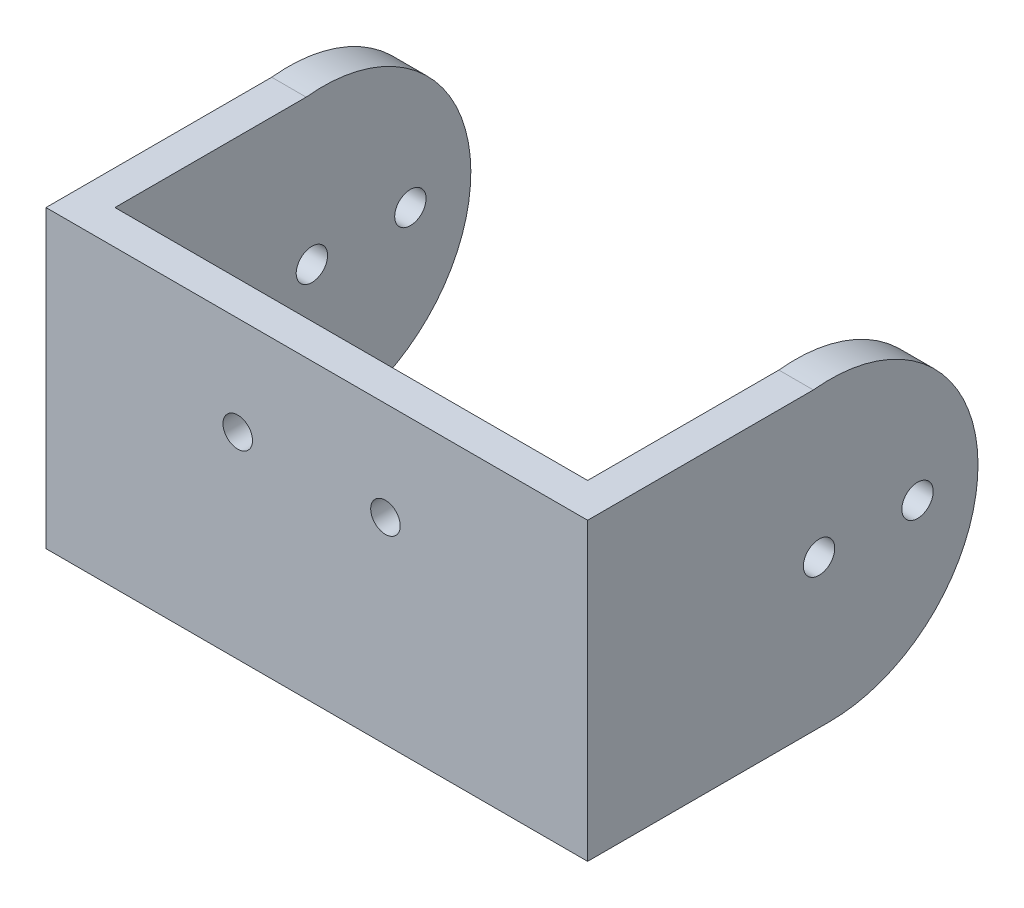
ISO-10303-21;
HEADER;
FILE_DESCRIPTION(('STEP AP214'),'2;1');
FILE_NAME('part.step','',(''),(''),'','','');
FILE_SCHEMA(('AUTOMOTIVE_DESIGN { 1 0 10303 214 1 1 1 1 }'));
ENDSEC;
DATA;
#1=APPLICATION_CONTEXT('core data for automotive mechanical design processes');
#2=APPLICATION_PROTOCOL_DEFINITION('international standard','automotive_design',2000,#1);
#3=PRODUCT_CONTEXT('',#1,'mechanical');
#4=PRODUCT('Part','Part','',(#3));
#5=PRODUCT_RELATED_PRODUCT_CATEGORY('part','',(#4));
#6=PRODUCT_DEFINITION_FORMATION('','',#4);
#7=PRODUCT_DEFINITION_CONTEXT('part definition',#1,'design');
#8=PRODUCT_DEFINITION('design','',#6,#7);
#9=PRODUCT_DEFINITION_SHAPE('','',#8);
#10=(LENGTH_UNIT() NAMED_UNIT(*) SI_UNIT(.MILLI.,.METRE.));
#11=(NAMED_UNIT(*) PLANE_ANGLE_UNIT() SI_UNIT($,.RADIAN.));
#12=(NAMED_UNIT(*) SI_UNIT($,.STERADIAN.) SOLID_ANGLE_UNIT());
#13=UNCERTAINTY_MEASURE_WITH_UNIT(LENGTH_MEASURE(1.E-05),#10,'distance_accuracy_value','');
#14=(GEOMETRIC_REPRESENTATION_CONTEXT(3) GLOBAL_UNCERTAINTY_ASSIGNED_CONTEXT((#13)) GLOBAL_UNIT_ASSIGNED_CONTEXT((#10,
#11,#12)) REPRESENTATION_CONTEXT('',''));
#15=CARTESIAN_POINT('',(0.,0.,0.));
#16=DIRECTION('',(0.,0.,1.));
#17=DIRECTION('',(1.,0.,0.));
#18=AXIS2_PLACEMENT_3D('',#15,#16,#17);
#19=CARTESIAN_POINT('',(-27.5,-15.,3.5));
#20=DIRECTION('',(1.,0.,0.));
#21=DIRECTION('',(0.,1.,0.));
#22=AXIS2_PLACEMENT_3D('',#19,#20,#21);
#23=PLANE('',#22);
#24=DIRECTION('',(0.,0.,-1.));
#25=VECTOR('',#24,1.);
#26=CARTESIAN_POINT('',(-27.5,15.,3.5));
#27=LINE('',#26,#25);
#28=CARTESIAN_POINT('',(-27.5,15.,3.5));
#29=VERTEX_POINT('',#28);
#30=CARTESIAN_POINT('',(-27.5,15.,-19.4197675165418));
#31=VERTEX_POINT('',#30);
#32=EDGE_CURVE('E172',#29,#31,#27,.T.);
#33=ORIENTED_EDGE('',*,*,#32,.T.);
#34=CARTESIAN_POINT('',(-27.5,0.046519708681584,-21.0930394173632));
#35=DIRECTION('',(1.,0.,0.));
#36=DIRECTION('',(0.,0.,1.));
#37=AXIS2_PLACEMENT_3D('',#34,#35,#36);
#38=CIRCLE('',#37,15.0468073582713);
#39=CARTESIAN_POINT('',(-27.5,-15.,-21.0000000000001));
#40=VERTEX_POINT('',#39);
#41=EDGE_CURVE('E111',#40,#31,#38,.T.);
#42=ORIENTED_EDGE('',*,*,#41,.F.);
#43=DIRECTION('',(0.,0.,-1.));
#44=VECTOR('',#43,1.);
#45=CARTESIAN_POINT('',(-27.5,-15.,3.5));
#46=LINE('',#45,#44);
#47=CARTESIAN_POINT('',(-27.5,-15.,3.5));
#48=VERTEX_POINT('',#47);
#49=EDGE_CURVE('E11',#48,#40,#46,.T.);
#50=ORIENTED_EDGE('',*,*,#49,.F.);
#51=DIRECTION('',(0.,-1.,0.));
#52=VECTOR('',#51,1.);
#53=CARTESIAN_POINT('',(-27.5,-15.,3.5));
#54=LINE('',#53,#52);
#55=EDGE_CURVE('E163',#29,#48,#54,.T.);
#56=ORIENTED_EDGE('',*,*,#55,.F.);
#57=EDGE_LOOP('',(#33,#42,#50,#56));
#58=FACE_BOUND('',#57,.T.);
#59=CARTESIAN_POINT('',(-27.5,0.,-20.));
#60=DIRECTION('',(1.,0.,0.));
#61=DIRECTION('',(0.,0.,-1.));
#62=AXIS2_PLACEMENT_3D('',#59,#60,#61);
#63=CIRCLE('',#62,1.59272352570657);
#64=CARTESIAN_POINT('',(-27.5,0.,-21.5927235257066));
#65=VERTEX_POINT('',#64);
#66=EDGE_CURVE('E126',#65,#65,#63,.T.);
#67=ORIENTED_EDGE('',*,*,#66,.T.);
#68=EDGE_LOOP('',(#67));
#69=FACE_BOUND('',#68,.T.);
#70=CARTESIAN_POINT('',(-27.5,-1.81701141093459E-13,-30.));
#71=DIRECTION('',(1.,0.,0.));
#72=DIRECTION('',(0.,0.,1.));
#73=AXIS2_PLACEMENT_3D('',#70,#71,#72);
#74=CIRCLE('',#73,1.59272352570657);
#75=CARTESIAN_POINT('',(-27.5,-1.81701141093459E-13,-28.4072764742934));
#76=VERTEX_POINT('',#75);
#77=EDGE_CURVE('E220',#76,#76,#74,.T.);
#78=ORIENTED_EDGE('',*,*,#77,.T.);
#79=EDGE_LOOP('',(#78));
#80=FACE_BOUND('',#79,.T.);
#81=ADVANCED_FACE('F34',(#58,#69,#80),#23,.F.);
#82=CARTESIAN_POINT('',(27.5,-15.,3.5));
#83=DIRECTION('',(0.,1.,0.));
#84=DIRECTION('',(-1.,0.,0.));
#85=AXIS2_PLACEMENT_3D('',#82,#83,#84);
#86=PLANE('',#85);
#87=ORIENTED_EDGE('',*,*,#49,.T.);
#88=DIRECTION('',(-1.,0.,0.));
#89=VECTOR('',#88,1.);
#90=CARTESIAN_POINT('',(-24.,-15.,-21.0000000000001));
#91=LINE('',#90,#89);
#92=CARTESIAN_POINT('',(-24.,-15.,-21.0000000000001));
#93=VERTEX_POINT('',#92);
#94=EDGE_CURVE('E114',#93,#40,#91,.T.);
#95=ORIENTED_EDGE('',*,*,#94,.F.);
#96=DIRECTION('',(0.,0.,-1.));
#97=VECTOR('',#96,1.);
#98=CARTESIAN_POINT('',(-24.,-15.,0.));
#99=LINE('',#98,#97);
#100=CARTESIAN_POINT('',(-24.,-15.,0.));
#101=VERTEX_POINT('',#100);
#102=EDGE_CURVE('E48',#101,#93,#99,.T.);
#103=ORIENTED_EDGE('',*,*,#102,.F.);
#104=DIRECTION('',(1.,0.,0.));
#105=VECTOR('',#104,1.);
#106=CARTESIAN_POINT('',(27.5,-15.,0.));
#107=LINE('',#106,#105);
#108=CARTESIAN_POINT('',(24.,-15.,0.));
#109=VERTEX_POINT('',#108);
#110=EDGE_CURVE('E53',#101,#109,#107,.T.);
#111=ORIENTED_EDGE('',*,*,#110,.T.);
#112=DIRECTION('',(0.,0.,-1.));
#113=VECTOR('',#112,1.);
#114=CARTESIAN_POINT('',(24.,-15.,0.));
#115=LINE('',#114,#113);
#116=CARTESIAN_POINT('',(24.,-15.,-21.0000000000001));
#117=VERTEX_POINT('',#116);
#118=EDGE_CURVE('E150',#109,#117,#115,.T.);
#119=ORIENTED_EDGE('',*,*,#118,.T.);
#120=DIRECTION('',(1.,0.,0.));
#121=VECTOR('',#120,1.);
#122=CARTESIAN_POINT('',(24.,-15.,-21.0000000000001));
#123=LINE('',#122,#121);
#124=CARTESIAN_POINT('',(27.5,-15.,-21.0000000000001));
#125=VERTEX_POINT('',#124);
#126=EDGE_CURVE('E155',#117,#125,#123,.T.);
#127=ORIENTED_EDGE('',*,*,#126,.T.);
#128=DIRECTION('',(0.,0.,-1.));
#129=VECTOR('',#128,1.);
#130=CARTESIAN_POINT('',(27.5,-15.,3.5));
#131=LINE('',#130,#129);
#132=CARTESIAN_POINT('',(27.5,-15.,3.5));
#133=VERTEX_POINT('',#132);
#134=EDGE_CURVE('E41',#133,#125,#131,.T.);
#135=ORIENTED_EDGE('',*,*,#134,.F.);
#136=DIRECTION('',(1.,0.,0.));
#137=VECTOR('',#136,1.);
#138=CARTESIAN_POINT('',(27.5,-15.,3.5));
#139=LINE('',#138,#137);
#140=EDGE_CURVE('E166',#48,#133,#139,.T.);
#141=ORIENTED_EDGE('',*,*,#140,.F.);
#142=EDGE_LOOP('',(#87,#95,#103,#111,#119,#127,#135,#141));
#143=FACE_BOUND('',#142,.T.);
#144=ADVANCED_FACE('F184',(#143),#86,.F.);
#145=CARTESIAN_POINT('',(27.5,-15.,3.5));
#146=DIRECTION('',(-1.,0.,0.));
#147=DIRECTION('',(0.,0.,1.));
#148=AXIS2_PLACEMENT_3D('',#145,#146,#147);
#149=PLANE('',#148);
#150=ORIENTED_EDGE('',*,*,#134,.T.);
#151=CARTESIAN_POINT('',(27.5,0.046519708681584,-21.0930394173632));
#152=DIRECTION('',(1.,0.,0.));
#153=DIRECTION('',(0.,0.,1.));
#154=AXIS2_PLACEMENT_3D('',#151,#152,#153);
#155=CIRCLE('',#154,15.0468073582713);
#156=CARTESIAN_POINT('',(27.5,15.,-19.4197675165418));
#157=VERTEX_POINT('',#156);
#158=EDGE_CURVE('E142',#125,#157,#155,.T.);
#159=ORIENTED_EDGE('',*,*,#158,.T.);
#160=DIRECTION('',(0.,0.,-1.));
#161=VECTOR('',#160,1.);
#162=CARTESIAN_POINT('',(27.5,15.,3.5));
#163=LINE('',#162,#161);
#164=CARTESIAN_POINT('',(27.5,15.,3.5));
#165=VERTEX_POINT('',#164);
#166=EDGE_CURVE('E176',#165,#157,#163,.T.);
#167=ORIENTED_EDGE('',*,*,#166,.F.);
#168=DIRECTION('',(0.,1.,0.));
#169=VECTOR('',#168,1.);
#170=CARTESIAN_POINT('',(27.5,-15.,3.5));
#171=LINE('',#170,#169);
#172=EDGE_CURVE('E168',#133,#165,#171,.T.);
#173=ORIENTED_EDGE('',*,*,#172,.F.);
#174=EDGE_LOOP('',(#150,#159,#167,#173));
#175=FACE_BOUND('',#174,.T.);
#176=CARTESIAN_POINT('',(27.5,-1.81701141093459E-13,-30.));
#177=DIRECTION('',(1.,0.,0.));
#178=DIRECTION('',(0.,0.,1.));
#179=AXIS2_PLACEMENT_3D('',#176,#177,#178);
#180=CIRCLE('',#179,1.59272352570657);
#181=CARTESIAN_POINT('',(27.5,-1.81701141093459E-13,-28.4072764742934));
#182=VERTEX_POINT('',#181);
#183=EDGE_CURVE('E131',#182,#182,#180,.T.);
#184=ORIENTED_EDGE('',*,*,#183,.F.);
#185=EDGE_LOOP('',(#184));
#186=FACE_BOUND('',#185,.T.);
#187=CARTESIAN_POINT('',(27.5,0.,-20.));
#188=DIRECTION('',(1.,0.,0.));
#189=DIRECTION('',(0.,0.,-1.));
#190=AXIS2_PLACEMENT_3D('',#187,#188,#189);
#191=CIRCLE('',#190,1.59272352570657);
#192=CARTESIAN_POINT('',(27.5,0.,-21.5927235257066));
#193=VERTEX_POINT('',#192);
#194=EDGE_CURVE('E136',#193,#193,#191,.T.);
#195=ORIENTED_EDGE('',*,*,#194,.F.);
#196=EDGE_LOOP('',(#195));
#197=FACE_BOUND('',#196,.T.);
#198=ADVANCED_FACE('F180',(#175,#186,#197),#149,.F.);
#199=CARTESIAN_POINT('',(27.5,15.,3.5));
#200=DIRECTION('',(0.,-1.,0.));
#201=DIRECTION('',(1.,0.,0.));
#202=AXIS2_PLACEMENT_3D('',#199,#200,#201);
#203=PLANE('',#202);
#204=ORIENTED_EDGE('',*,*,#166,.T.);
#205=DIRECTION('',(1.,0.,0.));
#206=VECTOR('',#205,1.);
#207=CARTESIAN_POINT('',(24.,15.,-19.4197675165418));
#208=LINE('',#207,#206);
#209=CARTESIAN_POINT('',(24.,15.,-19.4197675165418));
#210=VERTEX_POINT('',#209);
#211=EDGE_CURVE('E158',#210,#157,#208,.T.);
#212=ORIENTED_EDGE('',*,*,#211,.F.);
#213=DIRECTION('',(0.,0.,1.));
#214=VECTOR('',#213,1.);
#215=CARTESIAN_POINT('',(24.,15.,-19.4197675165418));
#216=LINE('',#215,#214);
#217=CARTESIAN_POINT('',(24.,15.,0.));
#218=VERTEX_POINT('',#217);
#219=EDGE_CURVE('E145',#210,#218,#216,.T.);
#220=ORIENTED_EDGE('',*,*,#219,.T.);
#221=DIRECTION('',(-1.,0.,0.));
#222=VECTOR('',#221,1.);
#223=CARTESIAN_POINT('',(27.5,15.,0.));
#224=LINE('',#223,#222);
#225=CARTESIAN_POINT('',(-24.,15.,0.));
#226=VERTEX_POINT('',#225);
#227=EDGE_CURVE('E121',#218,#226,#224,.T.);
#228=ORIENTED_EDGE('',*,*,#227,.T.);
#229=DIRECTION('',(0.,0.,1.));
#230=VECTOR('',#229,1.);
#231=CARTESIAN_POINT('',(-24.,15.,-19.4197675165418));
#232=LINE('',#231,#230);
#233=CARTESIAN_POINT('',(-24.,15.,-19.4197675165418));
#234=VERTEX_POINT('',#233);
#235=EDGE_CURVE('E101',#234,#226,#232,.T.);
#236=ORIENTED_EDGE('',*,*,#235,.F.);
#237=DIRECTION('',(-1.,0.,0.));
#238=VECTOR('',#237,1.);
#239=CARTESIAN_POINT('',(-24.,15.,-19.4197675165418));
#240=LINE('',#239,#238);
#241=EDGE_CURVE('E108',#234,#31,#240,.T.);
#242=ORIENTED_EDGE('',*,*,#241,.T.);
#243=ORIENTED_EDGE('',*,*,#32,.F.);
#244=DIRECTION('',(-1.,0.,0.));
#245=VECTOR('',#244,1.);
#246=CARTESIAN_POINT('',(27.5,15.,3.5));
#247=LINE('',#246,#245);
#248=EDGE_CURVE('E170',#165,#29,#247,.T.);
#249=ORIENTED_EDGE('',*,*,#248,.F.);
#250=EDGE_LOOP('',(#204,#212,#220,#228,#236,#242,#243,#249));
#251=FACE_BOUND('',#250,.T.);
#252=ADVANCED_FACE('F118',(#251),#203,.F.);
#253=CARTESIAN_POINT('',(0.,0.,3.5));
#254=DIRECTION('',(0.,0.,1.));
#255=DIRECTION('',(1.,0.,0.));
#256=AXIS2_PLACEMENT_3D('',#253,#254,#255);
#257=PLANE('',#256);
#258=CARTESIAN_POINT('',(6.97003369074222,4.99000000000001,3.5));
#259=DIRECTION('',(0.,0.,1.));
#260=DIRECTION('',(-1.,0.,0.));
#261=AXIS2_PLACEMENT_3D('',#258,#259,#260);
#262=CIRCLE('',#261,1.5);
#263=CARTESIAN_POINT('',(5.47003369074222,4.99000000000001,3.5));
#264=VERTEX_POINT('',#263);
#265=EDGE_CURVE('E227',#264,#264,#262,.T.);
#266=ORIENTED_EDGE('',*,*,#265,.F.);
#267=EDGE_LOOP('',(#266));
#268=FACE_BOUND('',#267,.T.);
#269=CARTESIAN_POINT('',(-8.02996630925778,4.99000000000001,3.5));
#270=DIRECTION('',(0.,0.,1.));
#271=DIRECTION('',(-1.,0.,0.));
#272=AXIS2_PLACEMENT_3D('',#269,#270,#271);
#273=CIRCLE('',#272,1.5);
#274=CARTESIAN_POINT('',(-9.52996630925778,4.99000000000001,3.5));
#275=VERTEX_POINT('',#274);
#276=EDGE_CURVE('E392',#275,#275,#273,.T.);
#277=ORIENTED_EDGE('',*,*,#276,.F.);
#278=EDGE_LOOP('',(#277));
#279=FACE_BOUND('',#278,.T.);
#280=ORIENTED_EDGE('',*,*,#55,.T.);
#281=ORIENTED_EDGE('',*,*,#140,.T.);
#282=ORIENTED_EDGE('',*,*,#172,.T.);
#283=ORIENTED_EDGE('',*,*,#248,.T.);
#284=EDGE_LOOP('',(#280,#281,#282,#283));
#285=FACE_BOUND('',#284,.T.);
#286=ADVANCED_FACE('F195',(#268,#279,#285),#257,.T.);
#287=CARTESIAN_POINT('',(0.,0.,0.));
#288=DIRECTION('',(0.,0.,1.));
#289=DIRECTION('',(1.,0.,0.));
#290=AXIS2_PLACEMENT_3D('',#287,#288,#289);
#291=PLANE('',#290);
#292=CARTESIAN_POINT('',(6.97003369074222,4.99000000000001,0.));
#293=DIRECTION('',(0.,0.,1.));
#294=DIRECTION('',(-1.,0.,0.));
#295=AXIS2_PLACEMENT_3D('',#292,#293,#294);
#296=CIRCLE('',#295,1.5);
#297=CARTESIAN_POINT('',(5.47003369074222,4.99000000000001,0.));
#298=VERTEX_POINT('',#297);
#299=EDGE_CURVE('E223',#298,#298,#296,.T.);
#300=ORIENTED_EDGE('',*,*,#299,.T.);
#301=EDGE_LOOP('',(#300));
#302=FACE_BOUND('',#301,.T.);
#303=CARTESIAN_POINT('',(-8.02996630925778,4.99000000000001,0.));
#304=DIRECTION('',(0.,0.,1.));
#305=DIRECTION('',(-1.,0.,0.));
#306=AXIS2_PLACEMENT_3D('',#303,#304,#305);
#307=CIRCLE('',#306,1.5);
#308=CARTESIAN_POINT('',(-9.52996630925778,4.99000000000001,0.));
#309=VERTEX_POINT('',#308);
#310=EDGE_CURVE('E389',#309,#309,#307,.T.);
#311=ORIENTED_EDGE('',*,*,#310,.T.);
#312=EDGE_LOOP('',(#311));
#313=FACE_BOUND('',#312,.T.);
#314=ORIENTED_EDGE('',*,*,#110,.F.);
#315=DIRECTION('',(0.,-1.,0.));
#316=VECTOR('',#315,1.);
#317=CARTESIAN_POINT('',(-24.,15.,0.));
#318=LINE('',#317,#316);
#319=EDGE_CURVE('E115',#226,#101,#318,.T.);
#320=ORIENTED_EDGE('',*,*,#319,.F.);
#321=ORIENTED_EDGE('',*,*,#227,.F.);
#322=DIRECTION('',(0.,-1.,0.));
#323=VECTOR('',#322,1.);
#324=CARTESIAN_POINT('',(24.,15.,0.));
#325=LINE('',#324,#323);
#326=EDGE_CURVE('E147',#218,#109,#325,.T.);
#327=ORIENTED_EDGE('',*,*,#326,.T.);
#328=EDGE_LOOP('',(#314,#320,#321,#327));
#329=FACE_BOUND('',#328,.T.);
#330=ADVANCED_FACE('F193',(#302,#313,#329),#291,.F.);
#331=CARTESIAN_POINT('',(24.,0.046519708681584,-21.0930394173632));
#332=DIRECTION('',(1.,0.,0.));
#333=DIRECTION('',(0.,0.,-1.));
#334=AXIS2_PLACEMENT_3D('',#331,#332,#333);
#335=CYLINDRICAL_SURFACE('',#334,15.0468073582713);
#336=ORIENTED_EDGE('',*,*,#158,.F.);
#337=ORIENTED_EDGE('',*,*,#126,.F.);
#338=CARTESIAN_POINT('',(24.,0.046519708681584,-21.0930394173632));
#339=DIRECTION('',(1.,0.,0.));
#340=DIRECTION('',(0.,0.,1.));
#341=AXIS2_PLACEMENT_3D('',#338,#339,#340);
#342=CIRCLE('',#341,15.0468073582713);
#343=EDGE_CURVE('E152',#117,#210,#342,.T.);
#344=ORIENTED_EDGE('',*,*,#343,.T.);
#345=ORIENTED_EDGE('',*,*,#211,.T.);
#346=EDGE_LOOP('',(#336,#337,#344,#345));
#347=FACE_BOUND('',#346,.T.);
#348=ADVANCED_FACE('F187',(#347),#335,.T.);
#349=CARTESIAN_POINT('',(24.,0.046519708681584,-21.0930394173632));
#350=DIRECTION('',(-1.,0.,0.));
#351=DIRECTION('',(0.,0.,1.));
#352=AXIS2_PLACEMENT_3D('',#349,#350,#351);
#353=PLANE('',#352);
#354=CARTESIAN_POINT('',(24.,-1.81701141093459E-13,-30.));
#355=DIRECTION('',(1.,0.,0.));
#356=DIRECTION('',(0.,0.,1.));
#357=AXIS2_PLACEMENT_3D('',#354,#355,#356);
#358=CIRCLE('',#357,1.59272352570657);
#359=CARTESIAN_POINT('',(24.,-1.81701141093459E-13,-28.4072764742934));
#360=VERTEX_POINT('',#359);
#361=EDGE_CURVE('E133',#360,#360,#358,.T.);
#362=ORIENTED_EDGE('',*,*,#361,.T.);
#363=EDGE_LOOP('',(#362));
#364=FACE_BOUND('',#363,.T.);
#365=CARTESIAN_POINT('',(24.,0.,-20.));
#366=DIRECTION('',(1.,0.,0.));
#367=DIRECTION('',(0.,0.,-1.));
#368=AXIS2_PLACEMENT_3D('',#365,#366,#367);
#369=CIRCLE('',#368,1.59272352570657);
#370=CARTESIAN_POINT('',(24.,0.,-21.5927235257066));
#371=VERTEX_POINT('',#370);
#372=EDGE_CURVE('E139',#371,#371,#369,.T.);
#373=ORIENTED_EDGE('',*,*,#372,.T.);
#374=EDGE_LOOP('',(#373));
#375=FACE_BOUND('',#374,.T.);
#376=ORIENTED_EDGE('',*,*,#219,.F.);
#377=ORIENTED_EDGE('',*,*,#343,.F.);
#378=ORIENTED_EDGE('',*,*,#118,.F.);
#379=ORIENTED_EDGE('',*,*,#326,.F.);
#380=EDGE_LOOP('',(#376,#377,#378,#379));
#381=FACE_BOUND('',#380,.T.);
#382=ADVANCED_FACE('F191',(#364,#375,#381),#353,.T.);
#383=CARTESIAN_POINT('',(24.,0.,-20.));
#384=DIRECTION('',(1.,0.,0.));
#385=DIRECTION('',(0.,0.,-1.));
#386=AXIS2_PLACEMENT_3D('',#383,#384,#385);
#387=CYLINDRICAL_SURFACE('',#386,1.59272352570657);
#388=ORIENTED_EDGE('',*,*,#372,.F.);
#389=EDGE_LOOP('',(#388));
#390=FACE_BOUND('',#389,.T.);
#391=ORIENTED_EDGE('',*,*,#194,.T.);
#392=EDGE_LOOP('',(#391));
#393=FACE_BOUND('',#392,.T.);
#394=ADVANCED_FACE('F244',(#390,#393),#387,.F.);
#395=CARTESIAN_POINT('',(24.,-1.81701141093459E-13,-30.));
#396=DIRECTION('',(1.,0.,0.));
#397=DIRECTION('',(0.,0.,-1.));
#398=AXIS2_PLACEMENT_3D('',#395,#396,#397);
#399=CYLINDRICAL_SURFACE('',#398,1.59272352570657);
#400=ORIENTED_EDGE('',*,*,#361,.F.);
#401=EDGE_LOOP('',(#400));
#402=FACE_BOUND('',#401,.T.);
#403=ORIENTED_EDGE('',*,*,#183,.T.);
#404=EDGE_LOOP('',(#403));
#405=FACE_BOUND('',#404,.T.);
#406=ADVANCED_FACE('F237',(#402,#405),#399,.F.);
#407=CARTESIAN_POINT('',(-24.,0.046519708681584,-21.0930394173632));
#408=DIRECTION('',(1.,0.,0.));
#409=DIRECTION('',(0.,0.,1.));
#410=AXIS2_PLACEMENT_3D('',#407,#408,#409);
#411=PLANE('',#410);
#412=CARTESIAN_POINT('',(-24.,0.,-20.));
#413=DIRECTION('',(1.,0.,0.));
#414=DIRECTION('',(0.,0.,-1.));
#415=AXIS2_PLACEMENT_3D('',#412,#413,#414);
#416=CIRCLE('',#415,1.59272352570657);
#417=CARTESIAN_POINT('',(-24.,0.,-21.5927235257066));
#418=VERTEX_POINT('',#417);
#419=EDGE_CURVE('E123',#418,#418,#416,.T.);
#420=ORIENTED_EDGE('',*,*,#419,.F.);
#421=EDGE_LOOP('',(#420));
#422=FACE_BOUND('',#421,.T.);
#423=ORIENTED_EDGE('',*,*,#235,.T.);
#424=ORIENTED_EDGE('',*,*,#319,.T.);
#425=ORIENTED_EDGE('',*,*,#102,.T.);
#426=CARTESIAN_POINT('',(-24.,0.046519708681584,-21.0930394173632));
#427=DIRECTION('',(1.,0.,0.));
#428=DIRECTION('',(0.,0.,1.));
#429=AXIS2_PLACEMENT_3D('',#426,#427,#428);
#430=CIRCLE('',#429,15.0468073582713);
#431=EDGE_CURVE('E96',#93,#234,#430,.T.);
#432=ORIENTED_EDGE('',*,*,#431,.T.);
#433=EDGE_LOOP('',(#423,#424,#425,#432));
#434=FACE_BOUND('',#433,.T.);
#435=CARTESIAN_POINT('',(-24.,-1.81701141093459E-13,-30.));
#436=DIRECTION('',(1.,0.,0.));
#437=DIRECTION('',(0.,0.,1.));
#438=AXIS2_PLACEMENT_3D('',#435,#436,#437);
#439=CIRCLE('',#438,1.59272352570657);
#440=CARTESIAN_POINT('',(-24.,-1.81701141093459E-13,-28.4072764742934));
#441=VERTEX_POINT('',#440);
#442=EDGE_CURVE('E222',#441,#441,#439,.T.);
#443=ORIENTED_EDGE('',*,*,#442,.F.);
#444=EDGE_LOOP('',(#443));
#445=FACE_BOUND('',#444,.T.);
#446=ADVANCED_FACE('F98',(#422,#434,#445),#411,.T.);
#447=CARTESIAN_POINT('',(-24.,0.046519708681584,-21.0930394173632));
#448=DIRECTION('',(-1.,0.,0.));
#449=DIRECTION('',(0.,0.,1.));
#450=AXIS2_PLACEMENT_3D('',#447,#448,#449);
#451=CYLINDRICAL_SURFACE('',#450,15.0468073582713);
#452=ORIENTED_EDGE('',*,*,#41,.T.);
#453=ORIENTED_EDGE('',*,*,#241,.F.);
#454=ORIENTED_EDGE('',*,*,#431,.F.);
#455=ORIENTED_EDGE('',*,*,#94,.T.);
#456=EDGE_LOOP('',(#452,#453,#454,#455));
#457=FACE_BOUND('',#456,.T.);
#458=ADVANCED_FACE('F109',(#457),#451,.T.);
#459=CARTESIAN_POINT('',(-24.,0.,-20.));
#460=DIRECTION('',(-1.,0.,0.));
#461=DIRECTION('',(0.,0.,1.));
#462=AXIS2_PLACEMENT_3D('',#459,#460,#461);
#463=CYLINDRICAL_SURFACE('',#462,1.59272352570657);
#464=ORIENTED_EDGE('',*,*,#419,.T.);
#465=EDGE_LOOP('',(#464));
#466=FACE_BOUND('',#465,.T.);
#467=ORIENTED_EDGE('',*,*,#66,.F.);
#468=EDGE_LOOP('',(#467));
#469=FACE_BOUND('',#468,.T.);
#470=ADVANCED_FACE('F233',(#466,#469),#463,.F.);
#471=CARTESIAN_POINT('',(-24.,-1.81701141093459E-13,-30.));
#472=DIRECTION('',(-1.,0.,0.));
#473=DIRECTION('',(0.,0.,1.));
#474=AXIS2_PLACEMENT_3D('',#471,#472,#473);
#475=CYLINDRICAL_SURFACE('',#474,1.59272352570657);
#476=ORIENTED_EDGE('',*,*,#442,.T.);
#477=EDGE_LOOP('',(#476));
#478=FACE_BOUND('',#477,.T.);
#479=ORIENTED_EDGE('',*,*,#77,.F.);
#480=EDGE_LOOP('',(#479));
#481=FACE_BOUND('',#480,.T.);
#482=ADVANCED_FACE('F282',(#478,#481),#475,.F.);
#483=CARTESIAN_POINT('',(-8.02996630925778,4.99000000000001,0.));
#484=DIRECTION('',(0.,0.,1.));
#485=DIRECTION('',(1.,0.,0.));
#486=AXIS2_PLACEMENT_3D('',#483,#484,#485);
#487=CYLINDRICAL_SURFACE('',#486,1.5);
#488=ORIENTED_EDGE('',*,*,#310,.F.);
#489=EDGE_LOOP('',(#488));
#490=FACE_BOUND('',#489,.T.);
#491=ORIENTED_EDGE('',*,*,#276,.T.);
#492=EDGE_LOOP('',(#491));
#493=FACE_BOUND('',#492,.T.);
#494=ADVANCED_FACE('F292',(#490,#493),#487,.F.);
#495=CARTESIAN_POINT('',(6.97003369074222,4.99000000000001,0.));
#496=DIRECTION('',(0.,0.,1.));
#497=DIRECTION('',(1.,0.,0.));
#498=AXIS2_PLACEMENT_3D('',#495,#496,#497);
#499=CYLINDRICAL_SURFACE('',#498,1.5);
#500=ORIENTED_EDGE('',*,*,#299,.F.);
#501=EDGE_LOOP('',(#500));
#502=FACE_BOUND('',#501,.T.);
#503=ORIENTED_EDGE('',*,*,#265,.T.);
#504=EDGE_LOOP('',(#503));
#505=FACE_BOUND('',#504,.T.);
#506=ADVANCED_FACE('F297',(#502,#505),#499,.F.);
#507=CLOSED_SHELL('',(#81,#144,#198,#252,#286,#330,#348,#382,#394,#406,#446,#458,#470,#482,#494,#506));
#508=MANIFOLD_SOLID_BREP('B2',#507);
#509=ADVANCED_BREP_SHAPE_REPRESENTATION('',(#18,#508),#14);
#510=SHAPE_DEFINITION_REPRESENTATION(#9,#509);
ENDSEC;
END-ISO-10303-21;
